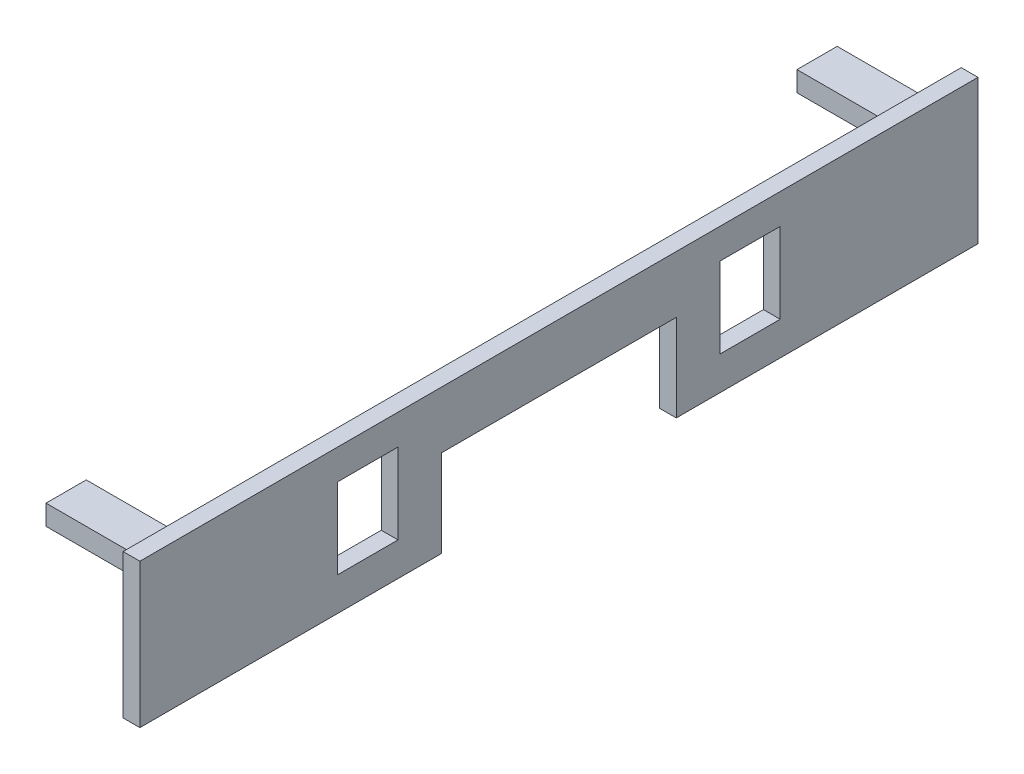
ISO-10303-21;
HEADER;
FILE_DESCRIPTION(('STEP AP214'),'2;1');
FILE_NAME('part.step','',(''),(''),'','','');
FILE_SCHEMA(('AUTOMOTIVE_DESIGN { 1 0 10303 214 1 1 1 1 }'));
ENDSEC;
DATA;
#1=APPLICATION_CONTEXT('core data for automotive mechanical design processes');
#2=APPLICATION_PROTOCOL_DEFINITION('international standard','automotive_design',2000,#1);
#3=PRODUCT_CONTEXT('',#1,'mechanical');
#4=PRODUCT('Part','Part','',(#3));
#5=PRODUCT_RELATED_PRODUCT_CATEGORY('part','',(#4));
#6=PRODUCT_DEFINITION_FORMATION('','',#4);
#7=PRODUCT_DEFINITION_CONTEXT('part definition',#1,'design');
#8=PRODUCT_DEFINITION('design','',#6,#7);
#9=PRODUCT_DEFINITION_SHAPE('','',#8);
#10=(LENGTH_UNIT() NAMED_UNIT(*) SI_UNIT(.MILLI.,.METRE.));
#11=(NAMED_UNIT(*) PLANE_ANGLE_UNIT() SI_UNIT($,.RADIAN.));
#12=(NAMED_UNIT(*) SI_UNIT($,.STERADIAN.) SOLID_ANGLE_UNIT());
#13=UNCERTAINTY_MEASURE_WITH_UNIT(LENGTH_MEASURE(1.E-05),#10,'distance_accuracy_value','');
#14=(GEOMETRIC_REPRESENTATION_CONTEXT(3) GLOBAL_UNCERTAINTY_ASSIGNED_CONTEXT((#13)) GLOBAL_UNIT_ASSIGNED_CONTEXT((#10,
#11,#12)) REPRESENTATION_CONTEXT('',''));
#15=CARTESIAN_POINT('',(0.,0.,0.));
#16=DIRECTION('',(0.,0.,1.));
#17=DIRECTION('',(1.,0.,0.));
#18=AXIS2_PLACEMENT_3D('',#15,#16,#17);
#19=CARTESIAN_POINT('',(12.5,43.,35.));
#20=DIRECTION('',(1.,0.,0.));
#21=DIRECTION('',(0.,0.,-1.));
#22=AXIS2_PLACEMENT_3D('',#19,#20,#21);
#23=PLANE('',#22);
#24=DIRECTION('',(0.,0.,1.));
#25=VECTOR('',#24,1.);
#26=CARTESIAN_POINT('',(12.5,0.,35.));
#27=LINE('',#26,#25);
#28=CARTESIAN_POINT('',(12.5,0.,35.));
#29=VERTEX_POINT('',#28);
#30=CARTESIAN_POINT('',(12.5,0.,125.));
#31=VERTEX_POINT('',#30);
#32=EDGE_CURVE('E474',#29,#31,#27,.T.);
#33=ORIENTED_EDGE('',*,*,#32,.T.);
#34=DIRECTION('',(0.,-1.,0.));
#35=VECTOR('',#34,1.);
#36=CARTESIAN_POINT('',(12.5,43.,125.));
#37=LINE('',#36,#35);
#38=CARTESIAN_POINT('',(12.5,43.,125.));
#39=VERTEX_POINT('',#38);
#40=EDGE_CURVE('E458',#39,#31,#37,.T.);
#41=ORIENTED_EDGE('',*,*,#40,.F.);
#42=DIRECTION('',(0.,0.,1.));
#43=VECTOR('',#42,1.);
#44=CARTESIAN_POINT('',(12.5,43.,35.));
#45=LINE('',#44,#43);
#46=CARTESIAN_POINT('',(12.5,43.,-125.));
#47=VERTEX_POINT('',#46);
#48=EDGE_CURVE('E478',#47,#39,#45,.T.);
#49=ORIENTED_EDGE('',*,*,#48,.F.);
#50=DIRECTION('',(0.,-1.,0.));
#51=VECTOR('',#50,1.);
#52=CARTESIAN_POINT('',(12.5,43.,-125.));
#53=LINE('',#52,#51);
#54=CARTESIAN_POINT('',(12.5,0.,-125.));
#55=VERTEX_POINT('',#54);
#56=EDGE_CURVE('E330',#47,#55,#53,.T.);
#57=ORIENTED_EDGE('',*,*,#56,.T.);
#58=DIRECTION('',(0.,0.,1.));
#59=VECTOR('',#58,1.);
#60=CARTESIAN_POINT('',(12.5,0.,-48.));
#61=LINE('',#60,#59);
#62=CARTESIAN_POINT('',(12.5,0.,-35.));
#63=VERTEX_POINT('',#62);
#64=EDGE_CURVE('E352',#55,#63,#61,.T.);
#65=ORIENTED_EDGE('',*,*,#64,.T.);
#66=DIRECTION('',(0.,-1.,0.));
#67=VECTOR('',#66,1.);
#68=CARTESIAN_POINT('',(12.5,43.,-35.));
#69=LINE('',#68,#67);
#70=CARTESIAN_POINT('',(12.5,26.,-35.));
#71=VERTEX_POINT('',#70);
#72=EDGE_CURVE('E364',#71,#63,#69,.T.);
#73=ORIENTED_EDGE('',*,*,#72,.F.);
#74=DIRECTION('',(0.,0.,1.));
#75=VECTOR('',#74,1.);
#76=CARTESIAN_POINT('',(12.5,26.,-35.));
#77=LINE('',#76,#75);
#78=CARTESIAN_POINT('',(12.5,26.,35.));
#79=VERTEX_POINT('',#78);
#80=EDGE_CURVE('E370',#71,#79,#77,.T.);
#81=ORIENTED_EDGE('',*,*,#80,.T.);
#82=DIRECTION('',(0.,-1.,0.));
#83=VECTOR('',#82,1.);
#84=CARTESIAN_POINT('',(12.5,43.,35.));
#85=LINE('',#84,#83);
#86=EDGE_CURVE('E481',#79,#29,#85,.T.);
#87=ORIENTED_EDGE('',*,*,#86,.T.);
#88=EDGE_LOOP('',(#33,#41,#49,#57,#65,#73,#81,#87));
#89=FACE_BOUND('',#88,.T.);
#90=DIRECTION('',(0.,-1.,0.));
#91=VECTOR('',#90,1.);
#92=CARTESIAN_POINT('',(12.5,43.,48.));
#93=LINE('',#92,#91);
#94=CARTESIAN_POINT('',(12.5,34.,48.));
#95=VERTEX_POINT('',#94);
#96=CARTESIAN_POINT('',(12.5,10.,48.));
#97=VERTEX_POINT('',#96);
#98=EDGE_CURVE('E11',#95,#97,#93,.T.);
#99=ORIENTED_EDGE('',*,*,#98,.F.);
#100=DIRECTION('',(0.,0.,1.));
#101=VECTOR('',#100,1.);
#102=CARTESIAN_POINT('',(12.5,34.,48.));
#103=LINE('',#102,#101);
#104=CARTESIAN_POINT('',(12.5,34.,66.));
#105=VERTEX_POINT('',#104);
#106=EDGE_CURVE('E436',#95,#105,#103,.T.);
#107=ORIENTED_EDGE('',*,*,#106,.T.);
#108=DIRECTION('',(0.,-1.,0.));
#109=VECTOR('',#108,1.);
#110=CARTESIAN_POINT('',(12.5,43.,66.));
#111=LINE('',#110,#109);
#112=CARTESIAN_POINT('',(12.5,10.,66.));
#113=VERTEX_POINT('',#112);
#114=EDGE_CURVE('E452',#105,#113,#111,.T.);
#115=ORIENTED_EDGE('',*,*,#114,.T.);
#116=DIRECTION('',(0.,0.,1.));
#117=VECTOR('',#116,1.);
#118=CARTESIAN_POINT('',(12.5,10.,48.));
#119=LINE('',#118,#117);
#120=EDGE_CURVE('E465',#97,#113,#119,.T.);
#121=ORIENTED_EDGE('',*,*,#120,.F.);
#122=EDGE_LOOP('',(#99,#107,#115,#121));
#123=FACE_BOUND('',#122,.T.);
#124=DIRECTION('',(0.,-1.,0.));
#125=VECTOR('',#124,1.);
#126=CARTESIAN_POINT('',(12.5,37.,118.));
#127=LINE('',#126,#125);
#128=CARTESIAN_POINT('',(12.5,37.,118.));
#129=VERTEX_POINT('',#128);
#130=CARTESIAN_POINT('',(12.5,31.,118.));
#131=VERTEX_POINT('',#130);
#132=EDGE_CURVE('E429',#129,#131,#127,.T.);
#133=ORIENTED_EDGE('',*,*,#132,.T.);
#134=DIRECTION('',(0.,0.,-1.));
#135=VECTOR('',#134,1.);
#136=CARTESIAN_POINT('',(12.5,31.,118.));
#137=LINE('',#136,#135);
#138=CARTESIAN_POINT('',(12.5,31.,106.));
#139=VERTEX_POINT('',#138);
#140=EDGE_CURVE('E425',#131,#139,#137,.T.);
#141=ORIENTED_EDGE('',*,*,#140,.T.);
#142=DIRECTION('',(0.,-1.,0.));
#143=VECTOR('',#142,1.);
#144=CARTESIAN_POINT('',(12.5,37.,106.));
#145=LINE('',#144,#143);
#146=CARTESIAN_POINT('',(12.5,37.,106.));
#147=VERTEX_POINT('',#146);
#148=EDGE_CURVE('E428',#147,#139,#145,.T.);
#149=ORIENTED_EDGE('',*,*,#148,.F.);
#150=DIRECTION('',(0.,0.,-1.));
#151=VECTOR('',#150,1.);
#152=CARTESIAN_POINT('',(12.5,37.,118.));
#153=LINE('',#152,#151);
#154=EDGE_CURVE('E415',#129,#147,#153,.T.);
#155=ORIENTED_EDGE('',*,*,#154,.F.);
#156=EDGE_LOOP('',(#133,#141,#149,#155));
#157=FACE_BOUND('',#156,.T.);
#158=DIRECTION('',(0.,0.,-1.));
#159=VECTOR('',#158,1.);
#160=CARTESIAN_POINT('',(12.5,30.2,108.));
#161=LINE('',#160,#159);
#162=CARTESIAN_POINT('',(12.5,30.2,108.));
#163=VERTEX_POINT('',#162);
#164=CARTESIAN_POINT('',(12.5,30.2,88.));
#165=VERTEX_POINT('',#164);
#166=EDGE_CURVE('E63',#163,#165,#161,.T.);
#167=ORIENTED_EDGE('',*,*,#166,.F.);
#168=DIRECTION('',(0.,-1.,0.));
#169=VECTOR('',#168,1.);
#170=CARTESIAN_POINT('',(12.5,30.2,108.));
#171=LINE('',#170,#169);
#172=CARTESIAN_POINT('',(12.5,20.,108.));
#173=VERTEX_POINT('',#172);
#174=EDGE_CURVE('E398',#163,#173,#171,.T.);
#175=ORIENTED_EDGE('',*,*,#174,.T.);
#176=DIRECTION('',(0.,0.,-1.));
#177=VECTOR('',#176,1.);
#178=CARTESIAN_POINT('',(12.5,20.,108.));
#179=LINE('',#178,#177);
#180=CARTESIAN_POINT('',(12.5,20.,88.));
#181=VERTEX_POINT('',#180);
#182=EDGE_CURVE('E394',#173,#181,#179,.T.);
#183=ORIENTED_EDGE('',*,*,#182,.T.);
#184=DIRECTION('',(0.,-1.,0.));
#185=VECTOR('',#184,1.);
#186=CARTESIAN_POINT('',(12.5,30.2,88.));
#187=LINE('',#186,#185);
#188=EDGE_CURVE('E400',#165,#181,#187,.T.);
#189=ORIENTED_EDGE('',*,*,#188,.F.);
#190=EDGE_LOOP('',(#167,#175,#183,#189));
#191=FACE_BOUND('',#190,.T.);
#192=DIRECTION('',(0.,0.,1.));
#193=VECTOR('',#192,1.);
#194=CARTESIAN_POINT('',(12.5,34.,-66.));
#195=LINE('',#194,#193);
#196=CARTESIAN_POINT('',(12.5,34.,-66.));
#197=VERTEX_POINT('',#196);
#198=CARTESIAN_POINT('',(12.5,34.,-48.));
#199=VERTEX_POINT('',#198);
#200=EDGE_CURVE('E315',#197,#199,#195,.T.);
#201=ORIENTED_EDGE('',*,*,#200,.T.);
#202=DIRECTION('',(0.,-1.,0.));
#203=VECTOR('',#202,1.);
#204=CARTESIAN_POINT('',(12.5,43.,-48.));
#205=LINE('',#204,#203);
#206=CARTESIAN_POINT('',(12.5,10.,-48.));
#207=VERTEX_POINT('',#206);
#208=EDGE_CURVE('E356',#199,#207,#205,.T.);
#209=ORIENTED_EDGE('',*,*,#208,.T.);
#210=DIRECTION('',(0.,0.,1.));
#211=VECTOR('',#210,1.);
#212=CARTESIAN_POINT('',(12.5,10.,-66.));
#213=LINE('',#212,#211);
#214=CARTESIAN_POINT('',(12.5,10.,-66.));
#215=VERTEX_POINT('',#214);
#216=EDGE_CURVE('E336',#215,#207,#213,.T.);
#217=ORIENTED_EDGE('',*,*,#216,.F.);
#218=DIRECTION('',(0.,-1.,0.));
#219=VECTOR('',#218,1.);
#220=CARTESIAN_POINT('',(12.5,43.,-66.));
#221=LINE('',#220,#219);
#222=EDGE_CURVE('E339',#197,#215,#221,.T.);
#223=ORIENTED_EDGE('',*,*,#222,.F.);
#224=EDGE_LOOP('',(#201,#209,#217,#223));
#225=FACE_BOUND('',#224,.T.);
#226=DIRECTION('',(0.,-1.,0.));
#227=VECTOR('',#226,1.);
#228=CARTESIAN_POINT('',(12.5,37.,-106.));
#229=LINE('',#228,#227);
#230=CARTESIAN_POINT('',(12.5,37.,-106.));
#231=VERTEX_POINT('',#230);
#232=CARTESIAN_POINT('',(12.5,31.,-106.));
#233=VERTEX_POINT('',#232);
#234=EDGE_CURVE('E308',#231,#233,#229,.T.);
#235=ORIENTED_EDGE('',*,*,#234,.T.);
#236=DIRECTION('',(0.,0.,-1.));
#237=VECTOR('',#236,1.);
#238=CARTESIAN_POINT('',(12.5,31.,-106.));
#239=LINE('',#238,#237);
#240=CARTESIAN_POINT('',(12.5,31.,-118.));
#241=VERTEX_POINT('',#240);
#242=EDGE_CURVE('E300',#233,#241,#239,.T.);
#243=ORIENTED_EDGE('',*,*,#242,.T.);
#244=DIRECTION('',(0.,-1.,0.));
#245=VECTOR('',#244,1.);
#246=CARTESIAN_POINT('',(12.5,37.,-118.));
#247=LINE('',#246,#245);
#248=CARTESIAN_POINT('',(12.5,37.,-118.));
#249=VERTEX_POINT('',#248);
#250=EDGE_CURVE('E301',#249,#241,#247,.T.);
#251=ORIENTED_EDGE('',*,*,#250,.F.);
#252=DIRECTION('',(0.,0.,-1.));
#253=VECTOR('',#252,1.);
#254=CARTESIAN_POINT('',(12.5,37.,-106.));
#255=LINE('',#254,#253);
#256=EDGE_CURVE('E292',#231,#249,#255,.T.);
#257=ORIENTED_EDGE('',*,*,#256,.F.);
#258=EDGE_LOOP('',(#235,#243,#251,#257));
#259=FACE_BOUND('',#258,.T.);
#260=DIRECTION('',(0.,0.,-1.));
#261=VECTOR('',#260,1.);
#262=CARTESIAN_POINT('',(12.5,30.2,-88.));
#263=LINE('',#262,#261);
#264=CARTESIAN_POINT('',(12.5,30.2,-88.));
#265=VERTEX_POINT('',#264);
#266=CARTESIAN_POINT('',(12.5,30.2,-108.));
#267=VERTEX_POINT('',#266);
#268=EDGE_CURVE('E261',#265,#267,#263,.T.);
#269=ORIENTED_EDGE('',*,*,#268,.F.);
#270=DIRECTION('',(0.,-1.,0.));
#271=VECTOR('',#270,1.);
#272=CARTESIAN_POINT('',(12.5,30.2,-88.));
#273=LINE('',#272,#271);
#274=CARTESIAN_POINT('',(12.5,20.,-88.));
#275=VERTEX_POINT('',#274);
#276=EDGE_CURVE('E256',#265,#275,#273,.T.);
#277=ORIENTED_EDGE('',*,*,#276,.T.);
#278=DIRECTION('',(0.,0.,-1.));
#279=VECTOR('',#278,1.);
#280=CARTESIAN_POINT('',(12.5,20.,-88.));
#281=LINE('',#280,#279);
#282=CARTESIAN_POINT('',(12.5,20.,-108.));
#283=VERTEX_POINT('',#282);
#284=EDGE_CURVE('E533',#275,#283,#281,.T.);
#285=ORIENTED_EDGE('',*,*,#284,.T.);
#286=DIRECTION('',(0.,-1.,0.));
#287=VECTOR('',#286,1.);
#288=CARTESIAN_POINT('',(12.5,30.2,-108.));
#289=LINE('',#288,#287);
#290=EDGE_CURVE('E282',#267,#283,#289,.T.);
#291=ORIENTED_EDGE('',*,*,#290,.F.);
#292=EDGE_LOOP('',(#269,#277,#285,#291));
#293=FACE_BOUND('',#292,.T.);
#294=ADVANCED_FACE('F43',(#89,#123,#157,#191,#225,#259,#293),#23,.F.);
#295=CARTESIAN_POINT('',(12.5,43.,48.));
#296=DIRECTION('',(0.,0.,-1.));
#297=DIRECTION('',(-1.,0.,0.));
#298=AXIS2_PLACEMENT_3D('',#295,#296,#297);
#299=PLANE('',#298);
#300=DIRECTION('',(0.,-1.,0.));
#301=VECTOR('',#300,1.);
#302=CARTESIAN_POINT('',(17.5,43.,48.));
#303=LINE('',#302,#301);
#304=CARTESIAN_POINT('',(17.5,34.,48.));
#305=VERTEX_POINT('',#304);
#306=CARTESIAN_POINT('',(17.5,10.,48.));
#307=VERTEX_POINT('',#306);
#308=EDGE_CURVE('E49',#305,#307,#303,.T.);
#309=ORIENTED_EDGE('',*,*,#308,.F.);
#310=DIRECTION('',(-1.,0.,0.));
#311=VECTOR('',#310,1.);
#312=CARTESIAN_POINT('',(17.5,34.,48.));
#313=LINE('',#312,#311);
#314=EDGE_CURVE('E441',#305,#95,#313,.T.);
#315=ORIENTED_EDGE('',*,*,#314,.T.);
#316=ORIENTED_EDGE('',*,*,#98,.T.);
#317=DIRECTION('',(-1.,0.,0.));
#318=VECTOR('',#317,1.);
#319=CARTESIAN_POINT('',(17.5,10.,48.));
#320=LINE('',#319,#318);
#321=EDGE_CURVE('E472',#307,#97,#320,.T.);
#322=ORIENTED_EDGE('',*,*,#321,.F.);
#323=EDGE_LOOP('',(#309,#315,#316,#322));
#324=FACE_BOUND('',#323,.T.);
#325=ADVANCED_FACE('F496',(#324),#299,.F.);
#326=CARTESIAN_POINT('',(17.5,43.,48.));
#327=DIRECTION('',(-1.,0.,0.));
#328=DIRECTION('',(0.,0.,1.));
#329=AXIS2_PLACEMENT_3D('',#326,#327,#328);
#330=PLANE('',#329);
#331=DIRECTION('',(0.,0.,-1.));
#332=VECTOR('',#331,1.);
#333=CARTESIAN_POINT('',(17.5,34.,66.));
#334=LINE('',#333,#332);
#335=CARTESIAN_POINT('',(17.5,34.,66.));
#336=VERTEX_POINT('',#335);
#337=EDGE_CURVE('E445',#336,#305,#334,.T.);
#338=ORIENTED_EDGE('',*,*,#337,.T.);
#339=ORIENTED_EDGE('',*,*,#308,.T.);
#340=DIRECTION('',(0.,0.,-1.));
#341=VECTOR('',#340,1.);
#342=CARTESIAN_POINT('',(17.5,10.,66.));
#343=LINE('',#342,#341);
#344=CARTESIAN_POINT('',(17.5,10.,66.));
#345=VERTEX_POINT('',#344);
#346=EDGE_CURVE('E466',#345,#307,#343,.T.);
#347=ORIENTED_EDGE('',*,*,#346,.F.);
#348=DIRECTION('',(0.,-1.,0.));
#349=VECTOR('',#348,1.);
#350=CARTESIAN_POINT('',(17.5,43.,66.));
#351=LINE('',#350,#349);
#352=EDGE_CURVE('E453',#336,#345,#351,.T.);
#353=ORIENTED_EDGE('',*,*,#352,.F.);
#354=EDGE_LOOP('',(#338,#339,#347,#353));
#355=FACE_BOUND('',#354,.T.);
#356=DIRECTION('',(0.,0.,-1.));
#357=VECTOR('',#356,1.);
#358=CARTESIAN_POINT('',(17.5,0.,48.));
#359=LINE('',#358,#357);
#360=CARTESIAN_POINT('',(17.5,0.,125.));
#361=VERTEX_POINT('',#360);
#362=CARTESIAN_POINT('',(17.5,0.,35.));
#363=VERTEX_POINT('',#362);
#364=EDGE_CURVE('E483',#361,#363,#359,.T.);
#365=ORIENTED_EDGE('',*,*,#364,.T.);
#366=DIRECTION('',(0.,-1.,0.));
#367=VECTOR('',#366,1.);
#368=CARTESIAN_POINT('',(17.5,43.,35.));
#369=LINE('',#368,#367);
#370=CARTESIAN_POINT('',(17.5,26.,35.));
#371=VERTEX_POINT('',#370);
#372=EDGE_CURVE('E487',#371,#363,#369,.T.);
#373=ORIENTED_EDGE('',*,*,#372,.F.);
#374=DIRECTION('',(0.,0.,-1.));
#375=VECTOR('',#374,1.);
#376=CARTESIAN_POINT('',(17.5,26.,35.));
#377=LINE('',#376,#375);
#378=CARTESIAN_POINT('',(17.5,26.,-35.));
#379=VERTEX_POINT('',#378);
#380=EDGE_CURVE('E60',#371,#379,#377,.T.);
#381=ORIENTED_EDGE('',*,*,#380,.T.);
#382=DIRECTION('',(0.,-1.,0.));
#383=VECTOR('',#382,1.);
#384=CARTESIAN_POINT('',(17.5,43.,-35.));
#385=LINE('',#384,#383);
#386=CARTESIAN_POINT('',(17.5,0.,-35.));
#387=VERTEX_POINT('',#386);
#388=EDGE_CURVE('E361',#379,#387,#385,.T.);
#389=ORIENTED_EDGE('',*,*,#388,.T.);
#390=DIRECTION('',(0.,0.,-1.));
#391=VECTOR('',#390,1.);
#392=CARTESIAN_POINT('',(17.5,0.,-35.));
#393=LINE('',#392,#391);
#394=CARTESIAN_POINT('',(17.5,0.,-125.));
#395=VERTEX_POINT('',#394);
#396=EDGE_CURVE('E360',#387,#395,#393,.T.);
#397=ORIENTED_EDGE('',*,*,#396,.T.);
#398=DIRECTION('',(0.,-1.,0.));
#399=VECTOR('',#398,1.);
#400=CARTESIAN_POINT('',(17.5,43.,-125.));
#401=LINE('',#400,#399);
#402=CARTESIAN_POINT('',(17.5,43.,-125.));
#403=VERTEX_POINT('',#402);
#404=EDGE_CURVE('E335',#403,#395,#401,.T.);
#405=ORIENTED_EDGE('',*,*,#404,.F.);
#406=DIRECTION('',(0.,0.,-1.));
#407=VECTOR('',#406,1.);
#408=CARTESIAN_POINT('',(17.5,43.,48.));
#409=LINE('',#408,#407);
#410=CARTESIAN_POINT('',(17.5,43.,125.));
#411=VERTEX_POINT('',#410);
#412=EDGE_CURVE('E476',#411,#403,#409,.T.);
#413=ORIENTED_EDGE('',*,*,#412,.F.);
#414=DIRECTION('',(0.,-1.,0.));
#415=VECTOR('',#414,1.);
#416=CARTESIAN_POINT('',(17.5,43.,125.));
#417=LINE('',#416,#415);
#418=EDGE_CURVE('E460',#411,#361,#417,.T.);
#419=ORIENTED_EDGE('',*,*,#418,.T.);
#420=EDGE_LOOP('',(#365,#373,#381,#389,#397,#405,#413,#419));
#421=FACE_BOUND('',#420,.T.);
#422=DIRECTION('',(0.,-1.,0.));
#423=VECTOR('',#422,1.);
#424=CARTESIAN_POINT('',(17.5,43.,-48.));
#425=LINE('',#424,#423);
#426=CARTESIAN_POINT('',(17.5,34.,-48.));
#427=VERTEX_POINT('',#426);
#428=CARTESIAN_POINT('',(17.5,10.,-48.));
#429=VERTEX_POINT('',#428);
#430=EDGE_CURVE('E363',#427,#429,#425,.T.);
#431=ORIENTED_EDGE('',*,*,#430,.F.);
#432=DIRECTION('',(0.,0.,-1.));
#433=VECTOR('',#432,1.);
#434=CARTESIAN_POINT('',(17.5,34.,-48.));
#435=LINE('',#434,#433);
#436=CARTESIAN_POINT('',(17.5,34.,-66.));
#437=VERTEX_POINT('',#436);
#438=EDGE_CURVE('E318',#427,#437,#435,.T.);
#439=ORIENTED_EDGE('',*,*,#438,.T.);
#440=DIRECTION('',(0.,-1.,0.));
#441=VECTOR('',#440,1.);
#442=CARTESIAN_POINT('',(17.5,43.,-66.));
#443=LINE('',#442,#441);
#444=CARTESIAN_POINT('',(17.5,10.,-66.));
#445=VERTEX_POINT('',#444);
#446=EDGE_CURVE('E333',#437,#445,#443,.T.);
#447=ORIENTED_EDGE('',*,*,#446,.T.);
#448=DIRECTION('',(0.,0.,-1.));
#449=VECTOR('',#448,1.);
#450=CARTESIAN_POINT('',(17.5,10.,-48.));
#451=LINE('',#450,#449);
#452=EDGE_CURVE('E343',#429,#445,#451,.T.);
#453=ORIENTED_EDGE('',*,*,#452,.F.);
#454=EDGE_LOOP('',(#431,#439,#447,#453));
#455=FACE_BOUND('',#454,.T.);
#456=ADVANCED_FACE('F493',(#355,#421,#455),#330,.F.);
#457=CARTESIAN_POINT('',(17.5,43.,35.));
#458=DIRECTION('',(0.,0.,1.));
#459=DIRECTION('',(1.,0.,0.));
#460=AXIS2_PLACEMENT_3D('',#457,#458,#459);
#461=PLANE('',#460);
#462=ORIENTED_EDGE('',*,*,#86,.F.);
#463=DIRECTION('',(1.,0.,0.));
#464=VECTOR('',#463,1.);
#465=CARTESIAN_POINT('',(12.5,26.,35.));
#466=LINE('',#465,#464);
#467=EDGE_CURVE('E367',#79,#371,#466,.T.);
#468=ORIENTED_EDGE('',*,*,#467,.T.);
#469=ORIENTED_EDGE('',*,*,#372,.T.);
#470=DIRECTION('',(-1.,0.,0.));
#471=VECTOR('',#470,1.);
#472=CARTESIAN_POINT('',(17.5,0.,35.));
#473=LINE('',#472,#471);
#474=EDGE_CURVE('E479',#363,#29,#473,.T.);
#475=ORIENTED_EDGE('',*,*,#474,.T.);
#476=EDGE_LOOP('',(#462,#468,#469,#475));
#477=FACE_BOUND('',#476,.T.);
#478=ADVANCED_FACE('F657',(#477),#461,.F.);
#479=CARTESIAN_POINT('',(0.,43.,0.));
#480=DIRECTION('',(0.,1.,0.));
#481=DIRECTION('',(0.,0.,1.));
#482=AXIS2_PLACEMENT_3D('',#479,#480,#481);
#483=PLANE('',#482);
#484=ORIENTED_EDGE('',*,*,#48,.T.);
#485=DIRECTION('',(1.,0.,0.));
#486=VECTOR('',#485,1.);
#487=CARTESIAN_POINT('',(12.5,43.,125.));
#488=LINE('',#487,#486);
#489=EDGE_CURVE('E450',#39,#411,#488,.T.);
#490=ORIENTED_EDGE('',*,*,#489,.T.);
#491=ORIENTED_EDGE('',*,*,#412,.T.);
#492=DIRECTION('',(-1.,0.,0.));
#493=VECTOR('',#492,1.);
#494=CARTESIAN_POINT('',(17.5,43.,-125.));
#495=LINE('',#494,#493);
#496=EDGE_CURVE('E322',#403,#47,#495,.T.);
#497=ORIENTED_EDGE('',*,*,#496,.T.);
#498=EDGE_LOOP('',(#484,#490,#491,#497));
#499=FACE_BOUND('',#498,.T.);
#500=ADVANCED_FACE('F654',(#499),#483,.T.);
#501=CARTESIAN_POINT('',(0.,0.,0.));
#502=DIRECTION('',(0.,1.,0.));
#503=DIRECTION('',(0.,0.,1.));
#504=AXIS2_PLACEMENT_3D('',#501,#502,#503);
#505=PLANE('',#504);
#506=ORIENTED_EDGE('',*,*,#32,.F.);
#507=ORIENTED_EDGE('',*,*,#474,.F.);
#508=ORIENTED_EDGE('',*,*,#364,.F.);
#509=DIRECTION('',(1.,0.,0.));
#510=VECTOR('',#509,1.);
#511=CARTESIAN_POINT('',(12.5,0.,125.));
#512=LINE('',#511,#510);
#513=EDGE_CURVE('E449',#31,#361,#512,.T.);
#514=ORIENTED_EDGE('',*,*,#513,.F.);
#515=EDGE_LOOP('',(#506,#507,#508,#514));
#516=FACE_BOUND('',#515,.T.);
#517=ADVANCED_FACE('F652',(#516),#505,.F.);
#518=CARTESIAN_POINT('',(0.,10.,0.));
#519=DIRECTION('',(0.,1.,0.));
#520=DIRECTION('',(0.,0.,1.));
#521=AXIS2_PLACEMENT_3D('',#518,#519,#520);
#522=PLANE('',#521);
#523=ORIENTED_EDGE('',*,*,#120,.T.);
#524=DIRECTION('',(1.,0.,0.));
#525=VECTOR('',#524,1.);
#526=CARTESIAN_POINT('',(12.5,10.,66.));
#527=LINE('',#526,#525);
#528=EDGE_CURVE('E467',#113,#345,#527,.T.);
#529=ORIENTED_EDGE('',*,*,#528,.T.);
#530=ORIENTED_EDGE('',*,*,#346,.T.);
#531=ORIENTED_EDGE('',*,*,#321,.T.);
#532=EDGE_LOOP('',(#523,#529,#530,#531));
#533=FACE_BOUND('',#532,.T.);
#534=ADVANCED_FACE('F505',(#533),#522,.T.);
#535=CARTESIAN_POINT('',(12.5,43.,125.));
#536=DIRECTION('',(0.,0.,-1.));
#537=DIRECTION('',(-1.,0.,0.));
#538=AXIS2_PLACEMENT_3D('',#535,#536,#537);
#539=PLANE('',#538);
#540=ORIENTED_EDGE('',*,*,#513,.T.);
#541=ORIENTED_EDGE('',*,*,#418,.F.);
#542=ORIENTED_EDGE('',*,*,#489,.F.);
#543=ORIENTED_EDGE('',*,*,#40,.T.);
#544=EDGE_LOOP('',(#540,#541,#542,#543));
#545=FACE_BOUND('',#544,.T.);
#546=ADVANCED_FACE('F648',(#545),#539,.F.);
#547=CARTESIAN_POINT('',(17.5,43.,66.));
#548=DIRECTION('',(0.,0.,1.));
#549=DIRECTION('',(1.,0.,0.));
#550=AXIS2_PLACEMENT_3D('',#547,#548,#549);
#551=PLANE('',#550);
#552=ORIENTED_EDGE('',*,*,#114,.F.);
#553=DIRECTION('',(1.,0.,0.));
#554=VECTOR('',#553,1.);
#555=CARTESIAN_POINT('',(12.5,34.,66.));
#556=LINE('',#555,#554);
#557=EDGE_CURVE('E438',#105,#336,#556,.T.);
#558=ORIENTED_EDGE('',*,*,#557,.T.);
#559=ORIENTED_EDGE('',*,*,#352,.T.);
#560=ORIENTED_EDGE('',*,*,#528,.F.);
#561=EDGE_LOOP('',(#552,#558,#559,#560));
#562=FACE_BOUND('',#561,.T.);
#563=ADVANCED_FACE('F510',(#562),#551,.F.);
#564=CARTESIAN_POINT('',(0.,34.,0.));
#565=DIRECTION('',(0.,1.,0.));
#566=DIRECTION('',(0.,0.,1.));
#567=AXIS2_PLACEMENT_3D('',#564,#565,#566);
#568=PLANE('',#567);
#569=ORIENTED_EDGE('',*,*,#106,.F.);
#570=ORIENTED_EDGE('',*,*,#314,.F.);
#571=ORIENTED_EDGE('',*,*,#337,.F.);
#572=ORIENTED_EDGE('',*,*,#557,.F.);
#573=EDGE_LOOP('',(#569,#570,#571,#572));
#574=FACE_BOUND('',#573,.T.);
#575=ADVANCED_FACE('F506',(#574),#568,.F.);
#576=CARTESIAN_POINT('',(-17.5,37.,106.));
#577=DIRECTION('',(1.,0.,0.));
#578=DIRECTION('',(0.,0.,-1.));
#579=AXIS2_PLACEMENT_3D('',#576,#577,#578);
#580=PLANE('',#579);
#581=DIRECTION('',(0.,0.,1.));
#582=VECTOR('',#581,1.);
#583=CARTESIAN_POINT('',(-17.5,31.,106.));
#584=LINE('',#583,#582);
#585=CARTESIAN_POINT('',(-17.5,31.,106.));
#586=VERTEX_POINT('',#585);
#587=CARTESIAN_POINT('',(-17.5,31.,118.));
#588=VERTEX_POINT('',#587);
#589=EDGE_CURVE('E403',#586,#588,#584,.T.);
#590=ORIENTED_EDGE('',*,*,#589,.T.);
#591=DIRECTION('',(0.,-1.,0.));
#592=VECTOR('',#591,1.);
#593=CARTESIAN_POINT('',(-17.5,37.,118.));
#594=LINE('',#593,#592);
#595=CARTESIAN_POINT('',(-17.5,37.,118.));
#596=VERTEX_POINT('',#595);
#597=EDGE_CURVE('E433',#596,#588,#594,.T.);
#598=ORIENTED_EDGE('',*,*,#597,.F.);
#599=DIRECTION('',(0.,0.,1.));
#600=VECTOR('',#599,1.);
#601=CARTESIAN_POINT('',(-17.5,37.,106.));
#602=LINE('',#601,#600);
#603=CARTESIAN_POINT('',(-17.5,37.,106.));
#604=VERTEX_POINT('',#603);
#605=EDGE_CURVE('E407',#604,#596,#602,.T.);
#606=ORIENTED_EDGE('',*,*,#605,.F.);
#607=DIRECTION('',(0.,-1.,0.));
#608=VECTOR('',#607,1.);
#609=CARTESIAN_POINT('',(-17.5,37.,106.));
#610=LINE('',#609,#608);
#611=EDGE_CURVE('E418',#604,#586,#610,.T.);
#612=ORIENTED_EDGE('',*,*,#611,.T.);
#613=EDGE_LOOP('',(#590,#598,#606,#612));
#614=FACE_BOUND('',#613,.T.);
#615=ADVANCED_FACE('F640',(#614),#580,.F.);
#616=CARTESIAN_POINT('',(-17.5,37.,118.));
#617=DIRECTION('',(0.,0.,-1.));
#618=DIRECTION('',(-1.,0.,0.));
#619=AXIS2_PLACEMENT_3D('',#616,#617,#618);
#620=PLANE('',#619);
#621=DIRECTION('',(1.,0.,0.));
#622=VECTOR('',#621,1.);
#623=CARTESIAN_POINT('',(-17.5,31.,118.));
#624=LINE('',#623,#622);
#625=EDGE_CURVE('E420',#588,#131,#624,.T.);
#626=ORIENTED_EDGE('',*,*,#625,.T.);
#627=ORIENTED_EDGE('',*,*,#132,.F.);
#628=DIRECTION('',(1.,0.,0.));
#629=VECTOR('',#628,1.);
#630=CARTESIAN_POINT('',(-17.5,37.,118.));
#631=LINE('',#630,#629);
#632=EDGE_CURVE('E406',#596,#129,#631,.T.);
#633=ORIENTED_EDGE('',*,*,#632,.F.);
#634=ORIENTED_EDGE('',*,*,#597,.T.);
#635=EDGE_LOOP('',(#626,#627,#633,#634));
#636=FACE_BOUND('',#635,.T.);
#637=ADVANCED_FACE('F633',(#636),#620,.F.);
#638=CARTESIAN_POINT('',(12.5,37.,106.));
#639=DIRECTION('',(0.,0.,1.));
#640=DIRECTION('',(1.,0.,0.));
#641=AXIS2_PLACEMENT_3D('',#638,#639,#640);
#642=PLANE('',#641);
#643=DIRECTION('',(-1.,0.,0.));
#644=VECTOR('',#643,1.);
#645=CARTESIAN_POINT('',(12.5,31.,106.));
#646=LINE('',#645,#644);
#647=EDGE_CURVE('E408',#139,#586,#646,.T.);
#648=ORIENTED_EDGE('',*,*,#647,.T.);
#649=ORIENTED_EDGE('',*,*,#611,.F.);
#650=DIRECTION('',(-1.,0.,0.));
#651=VECTOR('',#650,1.);
#652=CARTESIAN_POINT('',(12.5,37.,106.));
#653=LINE('',#652,#651);
#654=EDGE_CURVE('E411',#147,#604,#653,.T.);
#655=ORIENTED_EDGE('',*,*,#654,.F.);
#656=ORIENTED_EDGE('',*,*,#148,.T.);
#657=EDGE_LOOP('',(#648,#649,#655,#656));
#658=FACE_BOUND('',#657,.T.);
#659=ADVANCED_FACE('F630',(#658),#642,.F.);
#660=CARTESIAN_POINT('',(0.,37.,0.));
#661=DIRECTION('',(0.,1.,0.));
#662=DIRECTION('',(0.,0.,1.));
#663=AXIS2_PLACEMENT_3D('',#660,#661,#662);
#664=PLANE('',#663);
#665=ORIENTED_EDGE('',*,*,#605,.T.);
#666=ORIENTED_EDGE('',*,*,#632,.T.);
#667=ORIENTED_EDGE('',*,*,#154,.T.);
#668=ORIENTED_EDGE('',*,*,#654,.T.);
#669=EDGE_LOOP('',(#665,#666,#667,#668));
#670=FACE_BOUND('',#669,.T.);
#671=ADVANCED_FACE('F623',(#670),#664,.T.);
#672=CARTESIAN_POINT('',(0.,31.,0.));
#673=DIRECTION('',(0.,1.,0.));
#674=DIRECTION('',(0.,0.,1.));
#675=AXIS2_PLACEMENT_3D('',#672,#673,#674);
#676=PLANE('',#675);
#677=ORIENTED_EDGE('',*,*,#589,.F.);
#678=ORIENTED_EDGE('',*,*,#647,.F.);
#679=ORIENTED_EDGE('',*,*,#140,.F.);
#680=ORIENTED_EDGE('',*,*,#625,.F.);
#681=EDGE_LOOP('',(#677,#678,#679,#680));
#682=FACE_BOUND('',#681,.T.);
#683=ADVANCED_FACE('F621',(#682),#676,.F.);
#684=CARTESIAN_POINT('',(6.,30.2,88.));
#685=DIRECTION('',(1.,0.,0.));
#686=DIRECTION('',(0.,0.,-1.));
#687=AXIS2_PLACEMENT_3D('',#684,#685,#686);
#688=PLANE('',#687);
#689=DIRECTION('',(0.,0.,1.));
#690=VECTOR('',#689,1.);
#691=CARTESIAN_POINT('',(6.,20.,88.));
#692=LINE('',#691,#690);
#693=CARTESIAN_POINT('',(6.,20.,88.));
#694=VERTEX_POINT('',#693);
#695=CARTESIAN_POINT('',(6.,20.,108.));
#696=VERTEX_POINT('',#695);
#697=EDGE_CURVE('E376',#694,#696,#692,.T.);
#698=ORIENTED_EDGE('',*,*,#697,.T.);
#699=DIRECTION('',(0.,-1.,0.));
#700=VECTOR('',#699,1.);
#701=CARTESIAN_POINT('',(6.,30.2,108.));
#702=LINE('',#701,#700);
#703=CARTESIAN_POINT('',(6.,30.2,108.));
#704=VERTEX_POINT('',#703);
#705=EDGE_CURVE('E405',#704,#696,#702,.T.);
#706=ORIENTED_EDGE('',*,*,#705,.F.);
#707=DIRECTION('',(0.,0.,1.));
#708=VECTOR('',#707,1.);
#709=CARTESIAN_POINT('',(6.,30.2,88.));
#710=LINE('',#709,#708);
#711=CARTESIAN_POINT('',(6.,30.2,88.));
#712=VERTEX_POINT('',#711);
#713=EDGE_CURVE('E380',#712,#704,#710,.T.);
#714=ORIENTED_EDGE('',*,*,#713,.F.);
#715=DIRECTION('',(0.,-1.,0.));
#716=VECTOR('',#715,1.);
#717=CARTESIAN_POINT('',(6.,30.2,88.));
#718=LINE('',#717,#716);
#719=EDGE_CURVE('E387',#712,#694,#718,.T.);
#720=ORIENTED_EDGE('',*,*,#719,.T.);
#721=EDGE_LOOP('',(#698,#706,#714,#720));
#722=FACE_BOUND('',#721,.T.);
#723=ADVANCED_FACE('F616',(#722),#688,.F.);
#724=CARTESIAN_POINT('',(6.,30.2,108.));
#725=DIRECTION('',(0.,0.,-1.));
#726=DIRECTION('',(-1.,0.,0.));
#727=AXIS2_PLACEMENT_3D('',#724,#725,#726);
#728=PLANE('',#727);
#729=DIRECTION('',(1.,0.,0.));
#730=VECTOR('',#729,1.);
#731=CARTESIAN_POINT('',(6.,20.,108.));
#732=LINE('',#731,#730);
#733=EDGE_CURVE('E386',#696,#173,#732,.T.);
#734=ORIENTED_EDGE('',*,*,#733,.T.);
#735=ORIENTED_EDGE('',*,*,#174,.F.);
#736=DIRECTION('',(1.,0.,0.));
#737=VECTOR('',#736,1.);
#738=CARTESIAN_POINT('',(6.,30.2,108.));
#739=LINE('',#738,#737);
#740=EDGE_CURVE('E379',#704,#163,#739,.T.);
#741=ORIENTED_EDGE('',*,*,#740,.F.);
#742=ORIENTED_EDGE('',*,*,#705,.T.);
#743=EDGE_LOOP('',(#734,#735,#741,#742));
#744=FACE_BOUND('',#743,.T.);
#745=ADVANCED_FACE('F613',(#744),#728,.F.);
#746=CARTESIAN_POINT('',(12.5,30.2,88.));
#747=DIRECTION('',(0.,0.,1.));
#748=DIRECTION('',(1.,0.,0.));
#749=AXIS2_PLACEMENT_3D('',#746,#747,#748);
#750=PLANE('',#749);
#751=DIRECTION('',(-1.,0.,0.));
#752=VECTOR('',#751,1.);
#753=CARTESIAN_POINT('',(12.5,20.,88.));
#754=LINE('',#753,#752);
#755=EDGE_CURVE('E381',#181,#694,#754,.T.);
#756=ORIENTED_EDGE('',*,*,#755,.T.);
#757=ORIENTED_EDGE('',*,*,#719,.F.);
#758=DIRECTION('',(-1.,0.,0.));
#759=VECTOR('',#758,1.);
#760=CARTESIAN_POINT('',(12.5,30.2,88.));
#761=LINE('',#760,#759);
#762=EDGE_CURVE('E383',#165,#712,#761,.T.);
#763=ORIENTED_EDGE('',*,*,#762,.F.);
#764=ORIENTED_EDGE('',*,*,#188,.T.);
#765=EDGE_LOOP('',(#756,#757,#763,#764));
#766=FACE_BOUND('',#765,.T.);
#767=ADVANCED_FACE('F609',(#766),#750,.F.);
#768=CARTESIAN_POINT('',(0.,30.2,0.));
#769=DIRECTION('',(0.,1.,0.));
#770=DIRECTION('',(0.,0.,1.));
#771=AXIS2_PLACEMENT_3D('',#768,#769,#770);
#772=PLANE('',#771);
#773=ORIENTED_EDGE('',*,*,#713,.T.);
#774=ORIENTED_EDGE('',*,*,#740,.T.);
#775=ORIENTED_EDGE('',*,*,#166,.T.);
#776=ORIENTED_EDGE('',*,*,#762,.T.);
#777=EDGE_LOOP('',(#773,#774,#775,#776));
#778=FACE_BOUND('',#777,.T.);
#779=ADVANCED_FACE('F604',(#778),#772,.T.);
#780=CARTESIAN_POINT('',(0.,20.,0.));
#781=DIRECTION('',(0.,1.,0.));
#782=DIRECTION('',(0.,0.,1.));
#783=AXIS2_PLACEMENT_3D('',#780,#781,#782);
#784=PLANE('',#783);
#785=ORIENTED_EDGE('',*,*,#697,.F.);
#786=ORIENTED_EDGE('',*,*,#755,.F.);
#787=ORIENTED_EDGE('',*,*,#182,.F.);
#788=ORIENTED_EDGE('',*,*,#733,.F.);
#789=EDGE_LOOP('',(#785,#786,#787,#788));
#790=FACE_BOUND('',#789,.T.);
#791=ADVANCED_FACE('F603',(#790),#784,.F.);
#792=CARTESIAN_POINT('',(0.,26.,0.));
#793=DIRECTION('',(0.,1.,0.));
#794=DIRECTION('',(0.,0.,1.));
#795=AXIS2_PLACEMENT_3D('',#792,#793,#794);
#796=PLANE('',#795);
#797=ORIENTED_EDGE('',*,*,#80,.F.);
#798=DIRECTION('',(-1.,0.,0.));
#799=VECTOR('',#798,1.);
#800=CARTESIAN_POINT('',(17.5,26.,-35.));
#801=LINE('',#800,#799);
#802=EDGE_CURVE('E373',#379,#71,#801,.T.);
#803=ORIENTED_EDGE('',*,*,#802,.F.);
#804=ORIENTED_EDGE('',*,*,#380,.F.);
#805=ORIENTED_EDGE('',*,*,#467,.F.);
#806=EDGE_LOOP('',(#797,#803,#804,#805));
#807=FACE_BOUND('',#806,.T.);
#808=ADVANCED_FACE('F599',(#807),#796,.F.);
#809=CARTESIAN_POINT('',(12.5,43.,-35.));
#810=DIRECTION('',(0.,0.,-1.));
#811=DIRECTION('',(-1.,0.,0.));
#812=AXIS2_PLACEMENT_3D('',#809,#810,#811);
#813=PLANE('',#812);
#814=ORIENTED_EDGE('',*,*,#388,.F.);
#815=ORIENTED_EDGE('',*,*,#802,.T.);
#816=ORIENTED_EDGE('',*,*,#72,.T.);
#817=DIRECTION('',(1.,0.,0.));
#818=VECTOR('',#817,1.);
#819=CARTESIAN_POINT('',(12.5,0.,-35.));
#820=LINE('',#819,#818);
#821=EDGE_CURVE('E351',#63,#387,#820,.T.);
#822=ORIENTED_EDGE('',*,*,#821,.T.);
#823=EDGE_LOOP('',(#814,#815,#816,#822));
#824=FACE_BOUND('',#823,.T.);
#825=ADVANCED_FACE('F596',(#824),#813,.F.);
#826=CARTESIAN_POINT('',(17.5,43.,-48.));
#827=DIRECTION('',(0.,0.,1.));
#828=DIRECTION('',(1.,0.,0.));
#829=AXIS2_PLACEMENT_3D('',#826,#827,#828);
#830=PLANE('',#829);
#831=ORIENTED_EDGE('',*,*,#208,.F.);
#832=DIRECTION('',(1.,0.,0.));
#833=VECTOR('',#832,1.);
#834=CARTESIAN_POINT('',(12.5,34.,-48.));
#835=LINE('',#834,#833);
#836=EDGE_CURVE('E312',#199,#427,#835,.T.);
#837=ORIENTED_EDGE('',*,*,#836,.T.);
#838=ORIENTED_EDGE('',*,*,#430,.T.);
#839=DIRECTION('',(1.,0.,0.));
#840=VECTOR('',#839,1.);
#841=CARTESIAN_POINT('',(12.5,10.,-48.));
#842=LINE('',#841,#840);
#843=EDGE_CURVE('E345',#207,#429,#842,.T.);
#844=ORIENTED_EDGE('',*,*,#843,.F.);
#845=EDGE_LOOP('',(#831,#837,#838,#844));
#846=FACE_BOUND('',#845,.T.);
#847=ADVANCED_FACE('F595',(#846),#830,.F.);
#848=CARTESIAN_POINT('',(0.,0.,0.));
#849=DIRECTION('',(0.,1.,0.));
#850=DIRECTION('',(0.,0.,1.));
#851=AXIS2_PLACEMENT_3D('',#848,#849,#850);
#852=PLANE('',#851);
#853=ORIENTED_EDGE('',*,*,#64,.F.);
#854=DIRECTION('',(-1.,0.,0.));
#855=VECTOR('',#854,1.);
#856=CARTESIAN_POINT('',(17.5,0.,-125.));
#857=LINE('',#856,#855);
#858=EDGE_CURVE('E323',#395,#55,#857,.T.);
#859=ORIENTED_EDGE('',*,*,#858,.F.);
#860=ORIENTED_EDGE('',*,*,#396,.F.);
#861=ORIENTED_EDGE('',*,*,#821,.F.);
#862=EDGE_LOOP('',(#853,#859,#860,#861));
#863=FACE_BOUND('',#862,.T.);
#864=ADVANCED_FACE('F586',(#863),#852,.F.);
#865=CARTESIAN_POINT('',(0.,10.,0.));
#866=DIRECTION('',(0.,1.,0.));
#867=DIRECTION('',(0.,0.,1.));
#868=AXIS2_PLACEMENT_3D('',#865,#866,#867);
#869=PLANE('',#868);
#870=ORIENTED_EDGE('',*,*,#216,.T.);
#871=ORIENTED_EDGE('',*,*,#843,.T.);
#872=ORIENTED_EDGE('',*,*,#452,.T.);
#873=DIRECTION('',(-1.,0.,0.));
#874=VECTOR('',#873,1.);
#875=CARTESIAN_POINT('',(17.5,10.,-66.));
#876=LINE('',#875,#874);
#877=EDGE_CURVE('E346',#445,#215,#876,.T.);
#878=ORIENTED_EDGE('',*,*,#877,.T.);
#879=EDGE_LOOP('',(#870,#871,#872,#878));
#880=FACE_BOUND('',#879,.T.);
#881=ADVANCED_FACE('F585',(#880),#869,.T.);
#882=CARTESIAN_POINT('',(12.5,43.,-66.));
#883=DIRECTION('',(0.,0.,-1.));
#884=DIRECTION('',(-1.,0.,0.));
#885=AXIS2_PLACEMENT_3D('',#882,#883,#884);
#886=PLANE('',#885);
#887=ORIENTED_EDGE('',*,*,#446,.F.);
#888=DIRECTION('',(-1.,0.,0.));
#889=VECTOR('',#888,1.);
#890=CARTESIAN_POINT('',(17.5,34.,-66.));
#891=LINE('',#890,#889);
#892=EDGE_CURVE('E319',#437,#197,#891,.T.);
#893=ORIENTED_EDGE('',*,*,#892,.T.);
#894=ORIENTED_EDGE('',*,*,#222,.T.);
#895=ORIENTED_EDGE('',*,*,#877,.F.);
#896=EDGE_LOOP('',(#887,#893,#894,#895));
#897=FACE_BOUND('',#896,.T.);
#898=ADVANCED_FACE('F578',(#897),#886,.F.);
#899=CARTESIAN_POINT('',(17.5,43.,-125.));
#900=DIRECTION('',(0.,0.,1.));
#901=DIRECTION('',(1.,0.,0.));
#902=AXIS2_PLACEMENT_3D('',#899,#900,#901);
#903=PLANE('',#902);
#904=ORIENTED_EDGE('',*,*,#858,.T.);
#905=ORIENTED_EDGE('',*,*,#56,.F.);
#906=ORIENTED_EDGE('',*,*,#496,.F.);
#907=ORIENTED_EDGE('',*,*,#404,.T.);
#908=EDGE_LOOP('',(#904,#905,#906,#907));
#909=FACE_BOUND('',#908,.T.);
#910=ADVANCED_FACE('F577',(#909),#903,.F.);
#911=CARTESIAN_POINT('',(0.,34.,0.));
#912=DIRECTION('',(0.,1.,0.));
#913=DIRECTION('',(0.,0.,1.));
#914=AXIS2_PLACEMENT_3D('',#911,#912,#913);
#915=PLANE('',#914);
#916=ORIENTED_EDGE('',*,*,#200,.F.);
#917=ORIENTED_EDGE('',*,*,#892,.F.);
#918=ORIENTED_EDGE('',*,*,#438,.F.);
#919=ORIENTED_EDGE('',*,*,#836,.F.);
#920=EDGE_LOOP('',(#916,#917,#918,#919));
#921=FACE_BOUND('',#920,.T.);
#922=ADVANCED_FACE('F574',(#921),#915,.F.);
#923=CARTESIAN_POINT('',(-17.5,37.,-118.));
#924=DIRECTION('',(1.,0.,0.));
#925=DIRECTION('',(0.,0.,-1.));
#926=AXIS2_PLACEMENT_3D('',#923,#924,#925);
#927=PLANE('',#926);
#928=DIRECTION('',(0.,0.,1.));
#929=VECTOR('',#928,1.);
#930=CARTESIAN_POINT('',(-17.5,31.,-118.));
#931=LINE('',#930,#929);
#932=CARTESIAN_POINT('',(-17.5,31.,-118.));
#933=VERTEX_POINT('',#932);
#934=CARTESIAN_POINT('',(-17.5,31.,-106.));
#935=VERTEX_POINT('',#934);
#936=EDGE_CURVE('E277',#933,#935,#931,.T.);
#937=ORIENTED_EDGE('',*,*,#936,.T.);
#938=DIRECTION('',(0.,-1.,0.));
#939=VECTOR('',#938,1.);
#940=CARTESIAN_POINT('',(-17.5,37.,-106.));
#941=LINE('',#940,#939);
#942=CARTESIAN_POINT('',(-17.5,37.,-106.));
#943=VERTEX_POINT('',#942);
#944=EDGE_CURVE('E310',#943,#935,#941,.T.);
#945=ORIENTED_EDGE('',*,*,#944,.F.);
#946=DIRECTION('',(0.,0.,1.));
#947=VECTOR('',#946,1.);
#948=CARTESIAN_POINT('',(-17.5,37.,-118.));
#949=LINE('',#948,#947);
#950=CARTESIAN_POINT('',(-17.5,37.,-118.));
#951=VERTEX_POINT('',#950);
#952=EDGE_CURVE('E283',#951,#943,#949,.T.);
#953=ORIENTED_EDGE('',*,*,#952,.F.);
#954=DIRECTION('',(0.,-1.,0.));
#955=VECTOR('',#954,1.);
#956=CARTESIAN_POINT('',(-17.5,37.,-118.));
#957=LINE('',#956,#955);
#958=EDGE_CURVE('E294',#951,#933,#957,.T.);
#959=ORIENTED_EDGE('',*,*,#958,.T.);
#960=EDGE_LOOP('',(#937,#945,#953,#959));
#961=FACE_BOUND('',#960,.T.);
#962=ADVANCED_FACE('F566',(#961),#927,.F.);
#963=CARTESIAN_POINT('',(-17.5,37.,-106.));
#964=DIRECTION('',(0.,0.,-1.));
#965=DIRECTION('',(-1.,0.,0.));
#966=AXIS2_PLACEMENT_3D('',#963,#964,#965);
#967=PLANE('',#966);
#968=DIRECTION('',(1.,0.,0.));
#969=VECTOR('',#968,1.);
#970=CARTESIAN_POINT('',(-17.5,31.,-106.));
#971=LINE('',#970,#969);
#972=EDGE_CURVE('E276',#935,#233,#971,.T.);
#973=ORIENTED_EDGE('',*,*,#972,.T.);
#974=ORIENTED_EDGE('',*,*,#234,.F.);
#975=DIRECTION('',(1.,0.,0.));
#976=VECTOR('',#975,1.);
#977=CARTESIAN_POINT('',(-17.5,37.,-106.));
#978=LINE('',#977,#976);
#979=EDGE_CURVE('E289',#943,#231,#978,.T.);
#980=ORIENTED_EDGE('',*,*,#979,.F.);
#981=ORIENTED_EDGE('',*,*,#944,.T.);
#982=EDGE_LOOP('',(#973,#974,#980,#981));
#983=FACE_BOUND('',#982,.T.);
#984=ADVANCED_FACE('F561',(#983),#967,.F.);
#985=CARTESIAN_POINT('',(12.5,37.,-118.));
#986=DIRECTION('',(0.,0.,1.));
#987=DIRECTION('',(1.,0.,0.));
#988=AXIS2_PLACEMENT_3D('',#985,#986,#987);
#989=PLANE('',#988);
#990=DIRECTION('',(-1.,0.,0.));
#991=VECTOR('',#990,1.);
#992=CARTESIAN_POINT('',(12.5,31.,-118.));
#993=LINE('',#992,#991);
#994=EDGE_CURVE('E286',#241,#933,#993,.T.);
#995=ORIENTED_EDGE('',*,*,#994,.T.);
#996=ORIENTED_EDGE('',*,*,#958,.F.);
#997=DIRECTION('',(-1.,0.,0.));
#998=VECTOR('',#997,1.);
#999=CARTESIAN_POINT('',(12.5,37.,-118.));
#1000=LINE('',#999,#998);
#1001=EDGE_CURVE('E291',#249,#951,#1000,.T.);
#1002=ORIENTED_EDGE('',*,*,#1001,.F.);
#1003=ORIENTED_EDGE('',*,*,#250,.T.);
#1004=EDGE_LOOP('',(#995,#996,#1002,#1003));
#1005=FACE_BOUND('',#1004,.T.);
#1006=ADVANCED_FACE('F559',(#1005),#989,.F.);
#1007=CARTESIAN_POINT('',(0.,37.,0.));
#1008=DIRECTION('',(0.,1.,0.));
#1009=DIRECTION('',(0.,0.,1.));
#1010=AXIS2_PLACEMENT_3D('',#1007,#1008,#1009);
#1011=PLANE('',#1010);
#1012=ORIENTED_EDGE('',*,*,#952,.T.);
#1013=ORIENTED_EDGE('',*,*,#979,.T.);
#1014=ORIENTED_EDGE('',*,*,#256,.T.);
#1015=ORIENTED_EDGE('',*,*,#1001,.T.);
#1016=EDGE_LOOP('',(#1012,#1013,#1014,#1015));
#1017=FACE_BOUND('',#1016,.T.);
#1018=ADVANCED_FACE('F551',(#1017),#1011,.T.);
#1019=CARTESIAN_POINT('',(0.,31.,0.));
#1020=DIRECTION('',(0.,1.,0.));
#1021=DIRECTION('',(0.,0.,1.));
#1022=AXIS2_PLACEMENT_3D('',#1019,#1020,#1021);
#1023=PLANE('',#1022);
#1024=ORIENTED_EDGE('',*,*,#936,.F.);
#1025=ORIENTED_EDGE('',*,*,#994,.F.);
#1026=ORIENTED_EDGE('',*,*,#242,.F.);
#1027=ORIENTED_EDGE('',*,*,#972,.F.);
#1028=EDGE_LOOP('',(#1024,#1025,#1026,#1027));
#1029=FACE_BOUND('',#1028,.T.);
#1030=ADVANCED_FACE('F554',(#1029),#1023,.F.);
#1031=CARTESIAN_POINT('',(6.,30.2,-108.));
#1032=DIRECTION('',(1.,0.,0.));
#1033=DIRECTION('',(0.,0.,-1.));
#1034=AXIS2_PLACEMENT_3D('',#1031,#1032,#1033);
#1035=PLANE('',#1034);
#1036=DIRECTION('',(0.,0.,1.));
#1037=VECTOR('',#1036,1.);
#1038=CARTESIAN_POINT('',(6.,20.,-108.));
#1039=LINE('',#1038,#1037);
#1040=CARTESIAN_POINT('',(6.,20.,-108.));
#1041=VERTEX_POINT('',#1040);
#1042=CARTESIAN_POINT('',(6.,20.,-88.));
#1043=VERTEX_POINT('',#1042);
#1044=EDGE_CURVE('E274',#1041,#1043,#1039,.T.);
#1045=ORIENTED_EDGE('',*,*,#1044,.T.);
#1046=DIRECTION('',(0.,-1.,0.));
#1047=VECTOR('',#1046,1.);
#1048=CARTESIAN_POINT('',(6.,30.2,-88.));
#1049=LINE('',#1048,#1047);
#1050=CARTESIAN_POINT('',(6.,30.2,-88.));
#1051=VERTEX_POINT('',#1050);
#1052=EDGE_CURVE('E258',#1051,#1043,#1049,.T.);
#1053=ORIENTED_EDGE('',*,*,#1052,.F.);
#1054=DIRECTION('',(0.,0.,1.));
#1055=VECTOR('',#1054,1.);
#1056=CARTESIAN_POINT('',(6.,30.2,-108.));
#1057=LINE('',#1056,#1055);
#1058=CARTESIAN_POINT('',(6.,30.2,-108.));
#1059=VERTEX_POINT('',#1058);
#1060=EDGE_CURVE('E265',#1059,#1051,#1057,.T.);
#1061=ORIENTED_EDGE('',*,*,#1060,.F.);
#1062=DIRECTION('',(0.,-1.,0.));
#1063=VECTOR('',#1062,1.);
#1064=CARTESIAN_POINT('',(6.,30.2,-108.));
#1065=LINE('',#1064,#1063);
#1066=EDGE_CURVE('E523',#1059,#1041,#1065,.T.);
#1067=ORIENTED_EDGE('',*,*,#1066,.T.);
#1068=EDGE_LOOP('',(#1045,#1053,#1061,#1067));
#1069=FACE_BOUND('',#1068,.T.);
#1070=ADVANCED_FACE('F272',(#1069),#1035,.F.);
#1071=CARTESIAN_POINT('',(6.,30.2,-88.));
#1072=DIRECTION('',(0.,0.,-1.));
#1073=DIRECTION('',(-1.,0.,0.));
#1074=AXIS2_PLACEMENT_3D('',#1071,#1072,#1073);
#1075=PLANE('',#1074);
#1076=DIRECTION('',(1.,0.,0.));
#1077=VECTOR('',#1076,1.);
#1078=CARTESIAN_POINT('',(6.,20.,-88.));
#1079=LINE('',#1078,#1077);
#1080=EDGE_CURVE('E530',#1043,#275,#1079,.T.);
#1081=ORIENTED_EDGE('',*,*,#1080,.T.);
#1082=ORIENTED_EDGE('',*,*,#276,.F.);
#1083=DIRECTION('',(1.,0.,0.));
#1084=VECTOR('',#1083,1.);
#1085=CARTESIAN_POINT('',(6.,30.2,-88.));
#1086=LINE('',#1085,#1084);
#1087=EDGE_CURVE('E253',#1051,#265,#1086,.T.);
#1088=ORIENTED_EDGE('',*,*,#1087,.F.);
#1089=ORIENTED_EDGE('',*,*,#1052,.T.);
#1090=EDGE_LOOP('',(#1081,#1082,#1088,#1089));
#1091=FACE_BOUND('',#1090,.T.);
#1092=ADVANCED_FACE('F255',(#1091),#1075,.F.);
#1093=CARTESIAN_POINT('',(12.5,30.2,-108.));
#1094=DIRECTION('',(0.,0.,1.));
#1095=DIRECTION('',(1.,0.,0.));
#1096=AXIS2_PLACEMENT_3D('',#1093,#1094,#1095);
#1097=PLANE('',#1096);
#1098=DIRECTION('',(-1.,0.,0.));
#1099=VECTOR('',#1098,1.);
#1100=CARTESIAN_POINT('',(12.5,20.,-108.));
#1101=LINE('',#1100,#1099);
#1102=EDGE_CURVE('E271',#283,#1041,#1101,.T.);
#1103=ORIENTED_EDGE('',*,*,#1102,.T.);
#1104=ORIENTED_EDGE('',*,*,#1066,.F.);
#1105=DIRECTION('',(-1.,0.,0.));
#1106=VECTOR('',#1105,1.);
#1107=CARTESIAN_POINT('',(12.5,30.2,-108.));
#1108=LINE('',#1107,#1106);
#1109=EDGE_CURVE('E270',#267,#1059,#1108,.T.);
#1110=ORIENTED_EDGE('',*,*,#1109,.F.);
#1111=ORIENTED_EDGE('',*,*,#290,.T.);
#1112=EDGE_LOOP('',(#1103,#1104,#1110,#1111));
#1113=FACE_BOUND('',#1112,.T.);
#1114=ADVANCED_FACE('F536',(#1113),#1097,.F.);
#1115=CARTESIAN_POINT('',(0.,30.2,0.));
#1116=DIRECTION('',(0.,1.,0.));
#1117=DIRECTION('',(0.,0.,1.));
#1118=AXIS2_PLACEMENT_3D('',#1115,#1116,#1117);
#1119=PLANE('',#1118);
#1120=ORIENTED_EDGE('',*,*,#1060,.T.);
#1121=ORIENTED_EDGE('',*,*,#1087,.T.);
#1122=ORIENTED_EDGE('',*,*,#268,.T.);
#1123=ORIENTED_EDGE('',*,*,#1109,.T.);
#1124=EDGE_LOOP('',(#1120,#1121,#1122,#1123));
#1125=FACE_BOUND('',#1124,.T.);
#1126=ADVANCED_FACE('F264',(#1125),#1119,.T.);
#1127=CARTESIAN_POINT('',(0.,20.,0.));
#1128=DIRECTION('',(0.,1.,0.));
#1129=DIRECTION('',(0.,0.,1.));
#1130=AXIS2_PLACEMENT_3D('',#1127,#1128,#1129);
#1131=PLANE('',#1130);
#1132=ORIENTED_EDGE('',*,*,#1044,.F.);
#1133=ORIENTED_EDGE('',*,*,#1102,.F.);
#1134=ORIENTED_EDGE('',*,*,#284,.F.);
#1135=ORIENTED_EDGE('',*,*,#1080,.F.);
#1136=EDGE_LOOP('',(#1132,#1133,#1134,#1135));
#1137=FACE_BOUND('',#1136,.T.);
#1138=ADVANCED_FACE('F537',(#1137),#1131,.F.);
#1139=CLOSED_SHELL('',(#294,#325,#456,#478,#500,#517,#534,#546,#563,#575,#615,#637,#659,#671,
#683,#723,#745,#767,#779,#791,#808,#825,#847,#864,#881,#898,#910,#922,#962,#984,#1006,#1018,
#1030,#1070,#1092,#1114,#1126,#1138));
#1140=MANIFOLD_SOLID_BREP('B2',#1139);
#1141=ADVANCED_BREP_SHAPE_REPRESENTATION('',(#18,#1140),#14);
#1142=SHAPE_DEFINITION_REPRESENTATION(#9,#1141);
ENDSEC;
END-ISO-10303-21;
